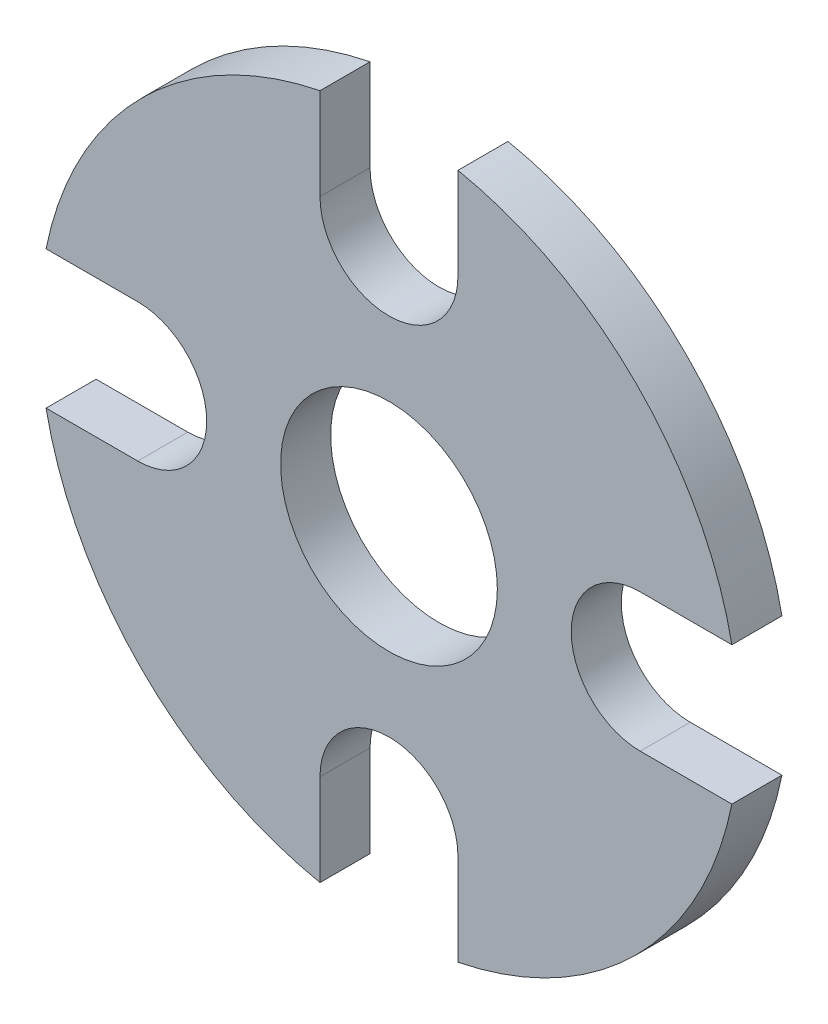
ISO-10303-21;
HEADER;
FILE_DESCRIPTION(('STEP AP214'),'2;1');
FILE_NAME('part.step','',(''),(''),'','','');
FILE_SCHEMA(('AUTOMOTIVE_DESIGN { 1 0 10303 214 1 1 1 1 }'));
ENDSEC;
DATA;
#1=APPLICATION_CONTEXT('core data for automotive mechanical design processes');
#2=APPLICATION_PROTOCOL_DEFINITION('international standard','automotive_design',2000,#1);
#3=PRODUCT_CONTEXT('',#1,'mechanical');
#4=PRODUCT('Part','Part','',(#3));
#5=PRODUCT_RELATED_PRODUCT_CATEGORY('part','',(#4));
#6=PRODUCT_DEFINITION_FORMATION('','',#4);
#7=PRODUCT_DEFINITION_CONTEXT('part definition',#1,'design');
#8=PRODUCT_DEFINITION('design','',#6,#7);
#9=PRODUCT_DEFINITION_SHAPE('','',#8);
#10=(LENGTH_UNIT() NAMED_UNIT(*) SI_UNIT(.MILLI.,.METRE.));
#11=(NAMED_UNIT(*) PLANE_ANGLE_UNIT() SI_UNIT($,.RADIAN.));
#12=(NAMED_UNIT(*) SI_UNIT($,.STERADIAN.) SOLID_ANGLE_UNIT());
#13=UNCERTAINTY_MEASURE_WITH_UNIT(LENGTH_MEASURE(1.E-05),#10,'distance_accuracy_value','');
#14=(GEOMETRIC_REPRESENTATION_CONTEXT(3) GLOBAL_UNCERTAINTY_ASSIGNED_CONTEXT((#13)) GLOBAL_UNIT_ASSIGNED_CONTEXT((#10,
#11,#12)) REPRESENTATION_CONTEXT('',''));
#15=CARTESIAN_POINT('',(0.,0.,0.));
#16=DIRECTION('',(0.,0.,1.));
#17=DIRECTION('',(1.,0.,0.));
#18=AXIS2_PLACEMENT_3D('',#15,#16,#17);
#19=CARTESIAN_POINT('',(-255.,0.,50.8));
#20=DIRECTION('',(0.,0.,-1.));
#21=DIRECTION('',(-1.,0.,0.));
#22=AXIS2_PLACEMENT_3D('',#19,#20,#21);
#23=CYLINDRICAL_SURFACE('',#22,70.);
#24=CARTESIAN_POINT('',(-255.,0.,0.));
#25=DIRECTION('',(0.,0.,1.));
#26=DIRECTION('',(1.,0.,0.));
#27=AXIS2_PLACEMENT_3D('',#24,#25,#26);
#28=CIRCLE('',#27,70.);
#29=CARTESIAN_POINT('',(-255.,-70.,0.));
#30=VERTEX_POINT('',#29);
#31=CARTESIAN_POINT('',(-255.,70.,0.));
#32=VERTEX_POINT('',#31);
#33=EDGE_CURVE('E184',#30,#32,#28,.T.);
#34=ORIENTED_EDGE('',*,*,#33,.F.);
#35=DIRECTION('',(0.,0.,-1.));
#36=VECTOR('',#35,1.);
#37=CARTESIAN_POINT('',(-255.,-70.,50.8));
#38=LINE('',#37,#36);
#39=CARTESIAN_POINT('',(-255.,-70.,50.8));
#40=VERTEX_POINT('',#39);
#41=EDGE_CURVE('E11',#40,#30,#38,.T.);
#42=ORIENTED_EDGE('',*,*,#41,.F.);
#43=CARTESIAN_POINT('',(-255.,0.,50.8));
#44=DIRECTION('',(0.,0.,1.));
#45=DIRECTION('',(1.,0.,0.));
#46=AXIS2_PLACEMENT_3D('',#43,#44,#45);
#47=CIRCLE('',#46,70.);
#48=CARTESIAN_POINT('',(-255.,70.,50.8));
#49=VERTEX_POINT('',#48);
#50=EDGE_CURVE('E222',#40,#49,#47,.T.);
#51=ORIENTED_EDGE('',*,*,#50,.T.);
#52=DIRECTION('',(0.,0.,-1.));
#53=VECTOR('',#52,1.);
#54=CARTESIAN_POINT('',(-255.,70.,50.8));
#55=LINE('',#54,#53);
#56=EDGE_CURVE('E115',#49,#32,#55,.T.);
#57=ORIENTED_EDGE('',*,*,#56,.T.);
#58=EDGE_LOOP('',(#34,#42,#51,#57));
#59=FACE_BOUND('',#58,.T.);
#60=ADVANCED_FACE('F41',(#59),#23,.F.);
#61=CARTESIAN_POINT('',(0.,-69.9999999999999,50.8));
#62=DIRECTION('',(0.,1.,0.));
#63=DIRECTION('',(-1.,0.,0.));
#64=AXIS2_PLACEMENT_3D('',#61,#62,#63);
#65=PLANE('',#64);
#66=DIRECTION('',(1.,0.,0.));
#67=VECTOR('',#66,1.);
#68=CARTESIAN_POINT('',(0.,-69.9999999999999,0.));
#69=LINE('',#68,#67);
#70=CARTESIAN_POINT('',(-348.030171105897,-70.,0.));
#71=VERTEX_POINT('',#70);
#72=EDGE_CURVE('E187',#71,#30,#69,.T.);
#73=ORIENTED_EDGE('',*,*,#72,.F.);
#74=DIRECTION('',(0.,0.,-1.));
#75=VECTOR('',#74,1.);
#76=CARTESIAN_POINT('',(-348.030171105897,-70.,50.8));
#77=LINE('',#76,#75);
#78=CARTESIAN_POINT('',(-348.030171105897,-70.,50.8));
#79=VERTEX_POINT('',#78);
#80=EDGE_CURVE('E49',#79,#71,#77,.T.);
#81=ORIENTED_EDGE('',*,*,#80,.F.);
#82=DIRECTION('',(1.,0.,0.));
#83=VECTOR('',#82,1.);
#84=CARTESIAN_POINT('',(0.,-69.9999999999999,50.8));
#85=LINE('',#84,#83);
#86=EDGE_CURVE('E261',#79,#40,#85,.T.);
#87=ORIENTED_EDGE('',*,*,#86,.T.);
#88=ORIENTED_EDGE('',*,*,#41,.T.);
#89=EDGE_LOOP('',(#73,#81,#87,#88));
#90=FACE_BOUND('',#89,.T.);
#91=ADVANCED_FACE('F260',(#90),#65,.T.);
#92=CARTESIAN_POINT('',(0.,0.,50.8));
#93=DIRECTION('',(0.,0.,-1.));
#94=DIRECTION('',(-1.,0.,0.));
#95=AXIS2_PLACEMENT_3D('',#92,#93,#94);
#96=CYLINDRICAL_SURFACE('',#95,355.);
#97=CARTESIAN_POINT('',(0.,0.,0.));
#98=DIRECTION('',(0.,0.,1.));
#99=DIRECTION('',(1.,0.,0.));
#100=AXIS2_PLACEMENT_3D('',#97,#98,#99);
#101=CIRCLE('',#100,355.);
#102=CARTESIAN_POINT('',(-70.,-348.030171105897,0.));
#103=VERTEX_POINT('',#102);
#104=EDGE_CURVE('E191',#71,#103,#101,.T.);
#105=ORIENTED_EDGE('',*,*,#104,.T.);
#106=DIRECTION('',(0.,0.,-1.));
#107=VECTOR('',#106,1.);
#108=CARTESIAN_POINT('',(-70.,-348.030171105897,50.8));
#109=LINE('',#108,#107);
#110=CARTESIAN_POINT('',(-70.,-348.030171105897,50.8));
#111=VERTEX_POINT('',#110);
#112=EDGE_CURVE('E246',#111,#103,#109,.T.);
#113=ORIENTED_EDGE('',*,*,#112,.F.);
#114=CARTESIAN_POINT('',(0.,0.,50.8));
#115=DIRECTION('',(0.,0.,1.));
#116=DIRECTION('',(1.,0.,0.));
#117=AXIS2_PLACEMENT_3D('',#114,#115,#116);
#118=CIRCLE('',#117,355.);
#119=EDGE_CURVE('E173',#79,#111,#118,.T.);
#120=ORIENTED_EDGE('',*,*,#119,.F.);
#121=ORIENTED_EDGE('',*,*,#80,.T.);
#122=EDGE_LOOP('',(#105,#113,#120,#121));
#123=FACE_BOUND('',#122,.T.);
#124=ADVANCED_FACE('F251',(#123),#96,.T.);
#125=CARTESIAN_POINT('',(-70.,0.,50.8));
#126=DIRECTION('',(-1.,0.,0.));
#127=DIRECTION('',(0.,0.,1.));
#128=AXIS2_PLACEMENT_3D('',#125,#126,#127);
#129=PLANE('',#128);
#130=DIRECTION('',(0.,1.,0.));
#131=VECTOR('',#130,1.);
#132=CARTESIAN_POINT('',(-70.,0.,0.));
#133=LINE('',#132,#131);
#134=CARTESIAN_POINT('',(-70.,-255.,0.));
#135=VERTEX_POINT('',#134);
#136=EDGE_CURVE('E193',#103,#135,#133,.T.);
#137=ORIENTED_EDGE('',*,*,#136,.T.);
#138=DIRECTION('',(0.,0.,-1.));
#139=VECTOR('',#138,1.);
#140=CARTESIAN_POINT('',(-70.,-255.,50.8));
#141=LINE('',#140,#139);
#142=CARTESIAN_POINT('',(-70.,-255.,50.8));
#143=VERTEX_POINT('',#142);
#144=EDGE_CURVE('E244',#143,#135,#141,.T.);
#145=ORIENTED_EDGE('',*,*,#144,.F.);
#146=DIRECTION('',(0.,1.,0.));
#147=VECTOR('',#146,1.);
#148=CARTESIAN_POINT('',(-70.,0.,50.8));
#149=LINE('',#148,#147);
#150=EDGE_CURVE('E271',#111,#143,#149,.T.);
#151=ORIENTED_EDGE('',*,*,#150,.F.);
#152=ORIENTED_EDGE('',*,*,#112,.T.);
#153=EDGE_LOOP('',(#137,#145,#151,#152));
#154=FACE_BOUND('',#153,.T.);
#155=ADVANCED_FACE('F329',(#154),#129,.F.);
#156=CARTESIAN_POINT('',(0.,-255.,50.8));
#157=DIRECTION('',(0.,0.,-1.));
#158=DIRECTION('',(-1.,0.,0.));
#159=AXIS2_PLACEMENT_3D('',#156,#157,#158);
#160=CYLINDRICAL_SURFACE('',#159,70.);
#161=CARTESIAN_POINT('',(0.,-255.,0.));
#162=DIRECTION('',(0.,0.,1.));
#163=DIRECTION('',(1.,0.,0.));
#164=AXIS2_PLACEMENT_3D('',#161,#162,#163);
#165=CIRCLE('',#164,70.);
#166=CARTESIAN_POINT('',(70.,-255.,0.));
#167=VERTEX_POINT('',#166);
#168=EDGE_CURVE('E197',#167,#135,#165,.T.);
#169=ORIENTED_EDGE('',*,*,#168,.F.);
#170=DIRECTION('',(0.,0.,-1.));
#171=VECTOR('',#170,1.);
#172=CARTESIAN_POINT('',(70.,-255.,50.8));
#173=LINE('',#172,#171);
#174=CARTESIAN_POINT('',(70.,-255.,50.8));
#175=VERTEX_POINT('',#174);
#176=EDGE_CURVE('E242',#175,#167,#173,.T.);
#177=ORIENTED_EDGE('',*,*,#176,.F.);
#178=CARTESIAN_POINT('',(0.,-255.,50.8));
#179=DIRECTION('',(0.,0.,1.));
#180=DIRECTION('',(1.,0.,0.));
#181=AXIS2_PLACEMENT_3D('',#178,#179,#180);
#182=CIRCLE('',#181,70.);
#183=EDGE_CURVE('E274',#175,#143,#182,.T.);
#184=ORIENTED_EDGE('',*,*,#183,.T.);
#185=ORIENTED_EDGE('',*,*,#144,.T.);
#186=EDGE_LOOP('',(#169,#177,#184,#185));
#187=FACE_BOUND('',#186,.T.);
#188=ADVANCED_FACE('F325',(#187),#160,.F.);
#189=CARTESIAN_POINT('',(70.,0.,50.8));
#190=DIRECTION('',(-1.,0.,0.));
#191=DIRECTION('',(0.,0.,1.));
#192=AXIS2_PLACEMENT_3D('',#189,#190,#191);
#193=PLANE('',#192);
#194=DIRECTION('',(0.,1.,0.));
#195=VECTOR('',#194,1.);
#196=CARTESIAN_POINT('',(70.,0.,0.));
#197=LINE('',#196,#195);
#198=CARTESIAN_POINT('',(70.,-348.030171105897,0.));
#199=VERTEX_POINT('',#198);
#200=EDGE_CURVE('E200',#199,#167,#197,.T.);
#201=ORIENTED_EDGE('',*,*,#200,.F.);
#202=DIRECTION('',(0.,0.,-1.));
#203=VECTOR('',#202,1.);
#204=CARTESIAN_POINT('',(70.,-348.030171105897,50.8));
#205=LINE('',#204,#203);
#206=CARTESIAN_POINT('',(70.,-348.030171105897,50.8));
#207=VERTEX_POINT('',#206);
#208=EDGE_CURVE('E240',#207,#199,#205,.T.);
#209=ORIENTED_EDGE('',*,*,#208,.F.);
#210=DIRECTION('',(0.,1.,0.));
#211=VECTOR('',#210,1.);
#212=CARTESIAN_POINT('',(70.,0.,50.8));
#213=LINE('',#212,#211);
#214=EDGE_CURVE('E277',#207,#175,#213,.T.);
#215=ORIENTED_EDGE('',*,*,#214,.T.);
#216=ORIENTED_EDGE('',*,*,#176,.T.);
#217=EDGE_LOOP('',(#201,#209,#215,#216));
#218=FACE_BOUND('',#217,.T.);
#219=ADVANCED_FACE('F322',(#218),#193,.T.);
#220=CARTESIAN_POINT('',(348.030171105897,-70.,0.));
#221=VERTEX_POINT('',#220);
#222=EDGE_CURVE('E194',#199,#221,#101,.T.);
#223=ORIENTED_EDGE('',*,*,#222,.T.);
#224=DIRECTION('',(0.,0.,-1.));
#225=VECTOR('',#224,1.);
#226=CARTESIAN_POINT('',(348.030171105897,-70.,50.8));
#227=LINE('',#226,#225);
#228=CARTESIAN_POINT('',(348.030171105897,-70.,50.8));
#229=VERTEX_POINT('',#228);
#230=EDGE_CURVE('E237',#229,#221,#227,.T.);
#231=ORIENTED_EDGE('',*,*,#230,.F.);
#232=EDGE_CURVE('E272',#207,#229,#118,.T.);
#233=ORIENTED_EDGE('',*,*,#232,.F.);
#234=ORIENTED_EDGE('',*,*,#208,.T.);
#235=EDGE_LOOP('',(#223,#231,#233,#234));
#236=FACE_BOUND('',#235,.T.);
#237=ADVANCED_FACE('F300',(#236),#96,.T.);
#238=CARTESIAN_POINT('',(0.,-70.,50.8));
#239=DIRECTION('',(0.,-1.,0.));
#240=DIRECTION('',(1.,0.,0.));
#241=AXIS2_PLACEMENT_3D('',#238,#239,#240);
#242=PLANE('',#241);
#243=DIRECTION('',(-1.,0.,0.));
#244=VECTOR('',#243,1.);
#245=CARTESIAN_POINT('',(0.,-70.,0.));
#246=LINE('',#245,#244);
#247=CARTESIAN_POINT('',(255.,-70.,0.));
#248=VERTEX_POINT('',#247);
#249=EDGE_CURVE('E203',#221,#248,#246,.T.);
#250=ORIENTED_EDGE('',*,*,#249,.T.);
#251=DIRECTION('',(0.,0.,-1.));
#252=VECTOR('',#251,1.);
#253=CARTESIAN_POINT('',(255.,-70.,50.8));
#254=LINE('',#253,#252);
#255=CARTESIAN_POINT('',(255.,-70.,50.8));
#256=VERTEX_POINT('',#255);
#257=EDGE_CURVE('E235',#256,#248,#254,.T.);
#258=ORIENTED_EDGE('',*,*,#257,.F.);
#259=DIRECTION('',(-1.,0.,0.));
#260=VECTOR('',#259,1.);
#261=CARTESIAN_POINT('',(0.,-70.,50.8));
#262=LINE('',#261,#260);
#263=EDGE_CURVE('E280',#229,#256,#262,.T.);
#264=ORIENTED_EDGE('',*,*,#263,.F.);
#265=ORIENTED_EDGE('',*,*,#230,.T.);
#266=EDGE_LOOP('',(#250,#258,#264,#265));
#267=FACE_BOUND('',#266,.T.);
#268=ADVANCED_FACE('F304',(#267),#242,.F.);
#269=CARTESIAN_POINT('',(255.,0.,50.8));
#270=DIRECTION('',(0.,0.,-1.));
#271=DIRECTION('',(-1.,0.,0.));
#272=AXIS2_PLACEMENT_3D('',#269,#270,#271);
#273=CYLINDRICAL_SURFACE('',#272,70.);
#274=CARTESIAN_POINT('',(255.,0.,0.));
#275=DIRECTION('',(0.,0.,1.));
#276=DIRECTION('',(1.,0.,0.));
#277=AXIS2_PLACEMENT_3D('',#274,#275,#276);
#278=CIRCLE('',#277,70.);
#279=CARTESIAN_POINT('',(255.,69.9999999999999,0.));
#280=VERTEX_POINT('',#279);
#281=EDGE_CURVE('E206',#280,#248,#278,.T.);
#282=ORIENTED_EDGE('',*,*,#281,.F.);
#283=DIRECTION('',(0.,0.,-1.));
#284=VECTOR('',#283,1.);
#285=CARTESIAN_POINT('',(255.,69.9999999999999,50.8));
#286=LINE('',#285,#284);
#287=CARTESIAN_POINT('',(255.,69.9999999999999,50.8));
#288=VERTEX_POINT('',#287);
#289=EDGE_CURVE('E233',#288,#280,#286,.T.);
#290=ORIENTED_EDGE('',*,*,#289,.F.);
#291=CARTESIAN_POINT('',(255.,0.,50.8));
#292=DIRECTION('',(0.,0.,1.));
#293=DIRECTION('',(1.,0.,0.));
#294=AXIS2_PLACEMENT_3D('',#291,#292,#293);
#295=CIRCLE('',#294,70.);
#296=EDGE_CURVE('E282',#288,#256,#295,.T.);
#297=ORIENTED_EDGE('',*,*,#296,.T.);
#298=ORIENTED_EDGE('',*,*,#257,.T.);
#299=EDGE_LOOP('',(#282,#290,#297,#298));
#300=FACE_BOUND('',#299,.T.);
#301=ADVANCED_FACE('F307',(#300),#273,.F.);
#302=CARTESIAN_POINT('',(0.,69.9999999999999,50.8));
#303=DIRECTION('',(0.,-1.,0.));
#304=DIRECTION('',(1.,0.,0.));
#305=AXIS2_PLACEMENT_3D('',#302,#303,#304);
#306=PLANE('',#305);
#307=DIRECTION('',(-1.,0.,0.));
#308=VECTOR('',#307,1.);
#309=CARTESIAN_POINT('',(0.,69.9999999999999,0.));
#310=LINE('',#309,#308);
#311=CARTESIAN_POINT('',(348.030171105897,69.9999999999999,0.));
#312=VERTEX_POINT('',#311);
#313=EDGE_CURVE('E209',#312,#280,#310,.T.);
#314=ORIENTED_EDGE('',*,*,#313,.F.);
#315=DIRECTION('',(0.,0.,-1.));
#316=VECTOR('',#315,1.);
#317=CARTESIAN_POINT('',(348.030171105897,69.9999999999999,50.8));
#318=LINE('',#317,#316);
#319=CARTESIAN_POINT('',(348.030171105897,69.9999999999999,50.8));
#320=VERTEX_POINT('',#319);
#321=EDGE_CURVE('E231',#320,#312,#318,.T.);
#322=ORIENTED_EDGE('',*,*,#321,.F.);
#323=DIRECTION('',(-1.,0.,0.));
#324=VECTOR('',#323,1.);
#325=CARTESIAN_POINT('',(0.,69.9999999999999,50.8));
#326=LINE('',#325,#324);
#327=EDGE_CURVE('E285',#320,#288,#326,.T.);
#328=ORIENTED_EDGE('',*,*,#327,.T.);
#329=ORIENTED_EDGE('',*,*,#289,.T.);
#330=EDGE_LOOP('',(#314,#322,#328,#329));
#331=FACE_BOUND('',#330,.T.);
#332=ADVANCED_FACE('F310',(#331),#306,.T.);
#333=CARTESIAN_POINT('',(70.,348.030171105897,0.));
#334=VERTEX_POINT('',#333);
#335=EDGE_CURVE('E212',#312,#334,#101,.T.);
#336=ORIENTED_EDGE('',*,*,#335,.T.);
#337=DIRECTION('',(0.,0.,-1.));
#338=VECTOR('',#337,1.);
#339=CARTESIAN_POINT('',(70.,348.030171105897,50.8));
#340=LINE('',#339,#338);
#341=CARTESIAN_POINT('',(70.,348.030171105897,50.8));
#342=VERTEX_POINT('',#341);
#343=EDGE_CURVE('E228',#342,#334,#340,.T.);
#344=ORIENTED_EDGE('',*,*,#343,.F.);
#345=EDGE_CURVE('E172',#320,#342,#118,.T.);
#346=ORIENTED_EDGE('',*,*,#345,.F.);
#347=ORIENTED_EDGE('',*,*,#321,.T.);
#348=EDGE_LOOP('',(#336,#344,#346,#347));
#349=FACE_BOUND('',#348,.T.);
#350=ADVANCED_FACE('F313',(#349),#96,.T.);
#351=CARTESIAN_POINT('',(70.,0.,50.8));
#352=DIRECTION('',(1.,0.,0.));
#353=DIRECTION('',(0.,1.,0.));
#354=AXIS2_PLACEMENT_3D('',#351,#352,#353);
#355=PLANE('',#354);
#356=DIRECTION('',(0.,-1.,0.));
#357=VECTOR('',#356,1.);
#358=CARTESIAN_POINT('',(70.,0.,0.));
#359=LINE('',#358,#357);
#360=CARTESIAN_POINT('',(70.,255.,0.));
#361=VERTEX_POINT('',#360);
#362=EDGE_CURVE('E213',#334,#361,#359,.T.);
#363=ORIENTED_EDGE('',*,*,#362,.T.);
#364=DIRECTION('',(0.,0.,-1.));
#365=VECTOR('',#364,1.);
#366=CARTESIAN_POINT('',(70.,255.,50.8));
#367=LINE('',#366,#365);
#368=CARTESIAN_POINT('',(70.,255.,50.8));
#369=VERTEX_POINT('',#368);
#370=EDGE_CURVE('E226',#369,#361,#367,.T.);
#371=ORIENTED_EDGE('',*,*,#370,.F.);
#372=DIRECTION('',(0.,-1.,0.));
#373=VECTOR('',#372,1.);
#374=CARTESIAN_POINT('',(70.,0.,50.8));
#375=LINE('',#374,#373);
#376=EDGE_CURVE('E179',#342,#369,#375,.T.);
#377=ORIENTED_EDGE('',*,*,#376,.F.);
#378=ORIENTED_EDGE('',*,*,#343,.T.);
#379=EDGE_LOOP('',(#363,#371,#377,#378));
#380=FACE_BOUND('',#379,.T.);
#381=ADVANCED_FACE('F316',(#380),#355,.F.);
#382=CARTESIAN_POINT('',(0.,255.,50.8));
#383=DIRECTION('',(0.,0.,-1.));
#384=DIRECTION('',(-1.,0.,0.));
#385=AXIS2_PLACEMENT_3D('',#382,#383,#384);
#386=CYLINDRICAL_SURFACE('',#385,70.);
#387=CARTESIAN_POINT('',(0.,255.,0.));
#388=DIRECTION('',(0.,0.,1.));
#389=DIRECTION('',(1.,0.,0.));
#390=AXIS2_PLACEMENT_3D('',#387,#388,#389);
#391=CIRCLE('',#390,70.);
#392=CARTESIAN_POINT('',(-70.,255.,0.));
#393=VERTEX_POINT('',#392);
#394=EDGE_CURVE('E216',#393,#361,#391,.T.);
#395=ORIENTED_EDGE('',*,*,#394,.F.);
#396=DIRECTION('',(0.,0.,-1.));
#397=VECTOR('',#396,1.);
#398=CARTESIAN_POINT('',(-70.,255.,50.8));
#399=LINE('',#398,#397);
#400=CARTESIAN_POINT('',(-70.,255.,50.8));
#401=VERTEX_POINT('',#400);
#402=EDGE_CURVE('E166',#401,#393,#399,.T.);
#403=ORIENTED_EDGE('',*,*,#402,.F.);
#404=CARTESIAN_POINT('',(0.,255.,50.8));
#405=DIRECTION('',(0.,0.,1.));
#406=DIRECTION('',(1.,0.,0.));
#407=AXIS2_PLACEMENT_3D('',#404,#405,#406);
#408=CIRCLE('',#407,70.);
#409=EDGE_CURVE('E177',#401,#369,#408,.T.);
#410=ORIENTED_EDGE('',*,*,#409,.T.);
#411=ORIENTED_EDGE('',*,*,#370,.T.);
#412=EDGE_LOOP('',(#395,#403,#410,#411));
#413=FACE_BOUND('',#412,.T.);
#414=ADVANCED_FACE('F319',(#413),#386,.F.);
#415=CARTESIAN_POINT('',(-69.9999999999999,0.,50.8));
#416=DIRECTION('',(1.,0.,0.));
#417=DIRECTION('',(0.,1.,0.));
#418=AXIS2_PLACEMENT_3D('',#415,#416,#417);
#419=PLANE('',#418);
#420=DIRECTION('',(0.,-1.,0.));
#421=VECTOR('',#420,1.);
#422=CARTESIAN_POINT('',(-69.9999999999999,0.,0.));
#423=LINE('',#422,#421);
#424=CARTESIAN_POINT('',(-70.,348.030171105897,0.));
#425=VERTEX_POINT('',#424);
#426=EDGE_CURVE('E165',#425,#393,#423,.T.);
#427=ORIENTED_EDGE('',*,*,#426,.F.);
#428=DIRECTION('',(0.,0.,-1.));
#429=VECTOR('',#428,1.);
#430=CARTESIAN_POINT('',(-70.,348.030171105897,50.8));
#431=LINE('',#430,#429);
#432=CARTESIAN_POINT('',(-70.,348.030171105897,50.8));
#433=VERTEX_POINT('',#432);
#434=EDGE_CURVE('E159',#433,#425,#431,.T.);
#435=ORIENTED_EDGE('',*,*,#434,.F.);
#436=DIRECTION('',(0.,-1.,0.));
#437=VECTOR('',#436,1.);
#438=CARTESIAN_POINT('',(-69.9999999999999,0.,50.8));
#439=LINE('',#438,#437);
#440=EDGE_CURVE('E163',#433,#401,#439,.T.);
#441=ORIENTED_EDGE('',*,*,#440,.T.);
#442=ORIENTED_EDGE('',*,*,#402,.T.);
#443=EDGE_LOOP('',(#427,#435,#441,#442));
#444=FACE_BOUND('',#443,.T.);
#445=ADVANCED_FACE('F161',(#444),#419,.T.);
#446=CARTESIAN_POINT('',(-348.030171105897,70.,0.));
#447=VERTEX_POINT('',#446);
#448=EDGE_CURVE('E108',#425,#447,#101,.T.);
#449=ORIENTED_EDGE('',*,*,#448,.T.);
#450=DIRECTION('',(0.,0.,-1.));
#451=VECTOR('',#450,1.);
#452=CARTESIAN_POINT('',(-348.030171105897,70.,50.8));
#453=LINE('',#452,#451);
#454=CARTESIAN_POINT('',(-348.030171105897,70.,50.8));
#455=VERTEX_POINT('',#454);
#456=EDGE_CURVE('E167',#455,#447,#453,.T.);
#457=ORIENTED_EDGE('',*,*,#456,.F.);
#458=EDGE_CURVE('E169',#433,#455,#118,.T.);
#459=ORIENTED_EDGE('',*,*,#458,.F.);
#460=ORIENTED_EDGE('',*,*,#434,.T.);
#461=EDGE_LOOP('',(#449,#457,#459,#460));
#462=FACE_BOUND('',#461,.T.);
#463=ADVANCED_FACE('F170',(#462),#96,.T.);
#464=CARTESIAN_POINT('',(0.,70.,50.8));
#465=DIRECTION('',(0.,1.,0.));
#466=DIRECTION('',(0.,0.,1.));
#467=AXIS2_PLACEMENT_3D('',#464,#465,#466);
#468=PLANE('',#467);
#469=DIRECTION('',(1.,0.,0.));
#470=VECTOR('',#469,1.);
#471=CARTESIAN_POINT('',(0.,70.,0.));
#472=LINE('',#471,#470);
#473=EDGE_CURVE('E220',#447,#32,#472,.T.);
#474=ORIENTED_EDGE('',*,*,#473,.T.);
#475=ORIENTED_EDGE('',*,*,#56,.F.);
#476=DIRECTION('',(1.,0.,0.));
#477=VECTOR('',#476,1.);
#478=CARTESIAN_POINT('',(0.,70.,50.8));
#479=LINE('',#478,#477);
#480=EDGE_CURVE('E57',#455,#49,#479,.T.);
#481=ORIENTED_EDGE('',*,*,#480,.F.);
#482=ORIENTED_EDGE('',*,*,#456,.T.);
#483=EDGE_LOOP('',(#474,#475,#481,#482));
#484=FACE_BOUND('',#483,.T.);
#485=ADVANCED_FACE('F264',(#484),#468,.F.);
#486=CARTESIAN_POINT('',(0.,0.,50.8));
#487=DIRECTION('',(0.,0.,1.));
#488=DIRECTION('',(1.,0.,0.));
#489=AXIS2_PLACEMENT_3D('',#486,#487,#488);
#490=PLANE('',#489);
#491=CARTESIAN_POINT('',(0.,0.,50.8));
#492=DIRECTION('',(0.,0.,1.));
#493=DIRECTION('',(1.,0.,0.));
#494=AXIS2_PLACEMENT_3D('',#491,#492,#493);
#495=CIRCLE('',#494,110.);
#496=CARTESIAN_POINT('',(110.,0.,50.8));
#497=VERTEX_POINT('',#496);
#498=EDGE_CURVE('E268',#497,#497,#495,.T.);
#499=ORIENTED_EDGE('',*,*,#498,.F.);
#500=EDGE_LOOP('',(#499));
#501=FACE_BOUND('',#500,.T.);
#502=ORIENTED_EDGE('',*,*,#50,.F.);
#503=ORIENTED_EDGE('',*,*,#86,.F.);
#504=ORIENTED_EDGE('',*,*,#119,.T.);
#505=ORIENTED_EDGE('',*,*,#150,.T.);
#506=ORIENTED_EDGE('',*,*,#183,.F.);
#507=ORIENTED_EDGE('',*,*,#214,.F.);
#508=ORIENTED_EDGE('',*,*,#232,.T.);
#509=ORIENTED_EDGE('',*,*,#263,.T.);
#510=ORIENTED_EDGE('',*,*,#296,.F.);
#511=ORIENTED_EDGE('',*,*,#327,.F.);
#512=ORIENTED_EDGE('',*,*,#345,.T.);
#513=ORIENTED_EDGE('',*,*,#376,.T.);
#514=ORIENTED_EDGE('',*,*,#409,.F.);
#515=ORIENTED_EDGE('',*,*,#440,.F.);
#516=ORIENTED_EDGE('',*,*,#458,.T.);
#517=ORIENTED_EDGE('',*,*,#480,.T.);
#518=EDGE_LOOP('',(#502,#503,#504,#505,#506,#507,#508,#509,#510,#511,#512,#513,#514,#515,#516,#517));
#519=FACE_BOUND('',#518,.T.);
#520=ADVANCED_FACE('F175',(#501,#519),#490,.T.);
#521=CARTESIAN_POINT('',(0.,0.,0.));
#522=DIRECTION('',(0.,0.,1.));
#523=DIRECTION('',(1.,0.,0.));
#524=AXIS2_PLACEMENT_3D('',#521,#522,#523);
#525=PLANE('',#524);
#526=CARTESIAN_POINT('',(0.,0.,0.));
#527=DIRECTION('',(0.,0.,1.));
#528=DIRECTION('',(1.,0.,0.));
#529=AXIS2_PLACEMENT_3D('',#526,#527,#528);
#530=CIRCLE('',#529,110.);
#531=CARTESIAN_POINT('',(110.,0.,0.));
#532=VERTEX_POINT('',#531);
#533=EDGE_CURVE('E188',#532,#532,#530,.T.);
#534=ORIENTED_EDGE('',*,*,#533,.T.);
#535=EDGE_LOOP('',(#534));
#536=FACE_BOUND('',#535,.T.);
#537=ORIENTED_EDGE('',*,*,#33,.T.);
#538=ORIENTED_EDGE('',*,*,#473,.F.);
#539=ORIENTED_EDGE('',*,*,#448,.F.);
#540=ORIENTED_EDGE('',*,*,#426,.T.);
#541=ORIENTED_EDGE('',*,*,#394,.T.);
#542=ORIENTED_EDGE('',*,*,#362,.F.);
#543=ORIENTED_EDGE('',*,*,#335,.F.);
#544=ORIENTED_EDGE('',*,*,#313,.T.);
#545=ORIENTED_EDGE('',*,*,#281,.T.);
#546=ORIENTED_EDGE('',*,*,#249,.F.);
#547=ORIENTED_EDGE('',*,*,#222,.F.);
#548=ORIENTED_EDGE('',*,*,#200,.T.);
#549=ORIENTED_EDGE('',*,*,#168,.T.);
#550=ORIENTED_EDGE('',*,*,#136,.F.);
#551=ORIENTED_EDGE('',*,*,#104,.F.);
#552=ORIENTED_EDGE('',*,*,#72,.T.);
#553=EDGE_LOOP('',(#537,#538,#539,#540,#541,#542,#543,#544,#545,#546,#547,#548,#549,#550,#551,#552));
#554=FACE_BOUND('',#553,.T.);
#555=ADVANCED_FACE('F259',(#536,#554),#525,.F.);
#556=CARTESIAN_POINT('',(0.,0.,0.));
#557=DIRECTION('',(0.,0.,1.));
#558=DIRECTION('',(1.,0.,0.));
#559=AXIS2_PLACEMENT_3D('',#556,#557,#558);
#560=CYLINDRICAL_SURFACE('',#559,110.);
#561=ORIENTED_EDGE('',*,*,#533,.F.);
#562=EDGE_LOOP('',(#561));
#563=FACE_BOUND('',#562,.T.);
#564=ORIENTED_EDGE('',*,*,#498,.T.);
#565=EDGE_LOOP('',(#564));
#566=FACE_BOUND('',#565,.T.);
#567=ADVANCED_FACE('F461',(#563,#566),#560,.F.);
#568=CLOSED_SHELL('',(#60,#91,#124,#155,#188,#219,#237,#268,#301,#332,#350,#381,#414,#445,#463,
#485,#520,#555,#567));
#569=MANIFOLD_SOLID_BREP('B2',#568);
#570=ADVANCED_BREP_SHAPE_REPRESENTATION('',(#18,#569),#14);
#571=SHAPE_DEFINITION_REPRESENTATION(#9,#570);
ENDSEC;
END-ISO-10303-21;
